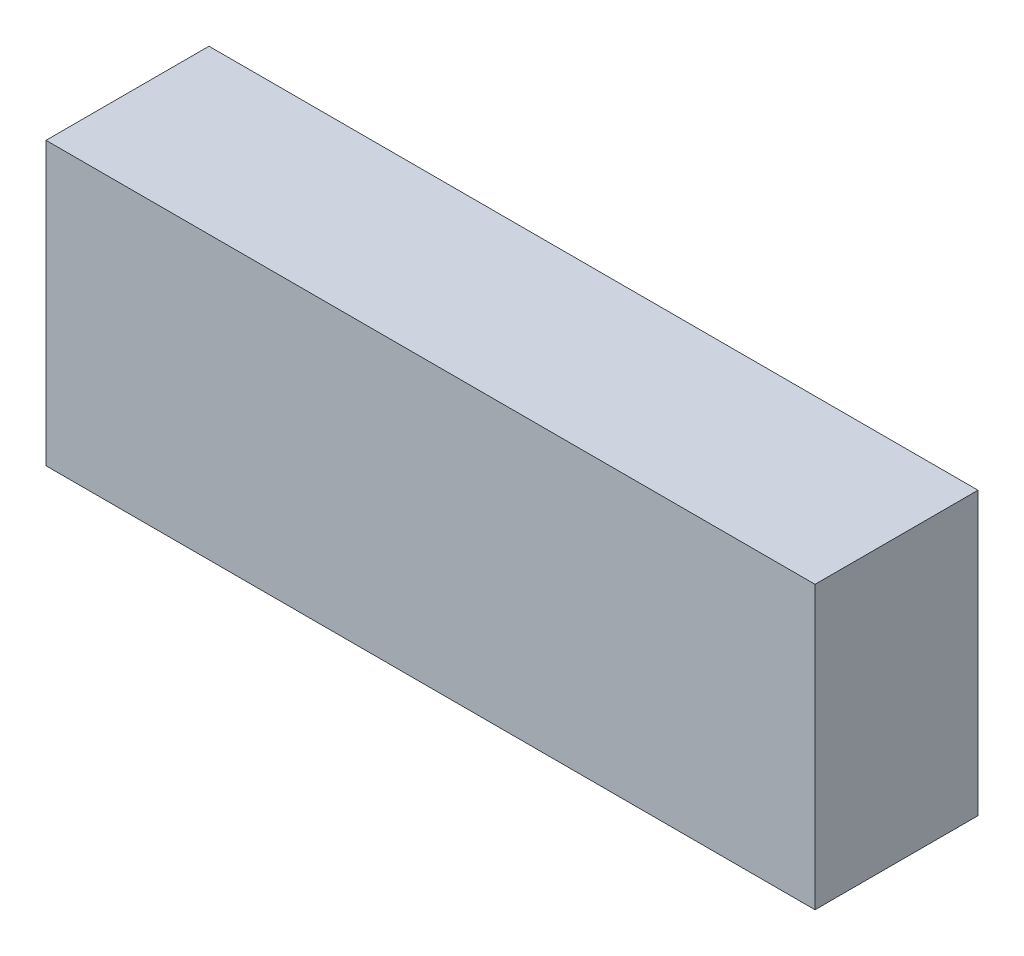
ISO-10303-21;
HEADER;
FILE_DESCRIPTION(('STEP AP214'),'2;1');
FILE_NAME('part.step','',(''),(''),'','','');
FILE_SCHEMA(('AUTOMOTIVE_DESIGN { 1 0 10303 214 1 1 1 1 }'));
ENDSEC;
DATA;
#1=APPLICATION_CONTEXT('core data for automotive mechanical design processes');
#2=APPLICATION_PROTOCOL_DEFINITION('international standard','automotive_design',2000,#1);
#3=PRODUCT_CONTEXT('',#1,'mechanical');
#4=PRODUCT('Part','Part','',(#3));
#5=PRODUCT_RELATED_PRODUCT_CATEGORY('part','',(#4));
#6=PRODUCT_DEFINITION_FORMATION('','',#4);
#7=PRODUCT_DEFINITION_CONTEXT('part definition',#1,'design');
#8=PRODUCT_DEFINITION('design','',#6,#7);
#9=PRODUCT_DEFINITION_SHAPE('','',#8);
#10=(LENGTH_UNIT() NAMED_UNIT(*) SI_UNIT(.MILLI.,.METRE.));
#11=(NAMED_UNIT(*) PLANE_ANGLE_UNIT() SI_UNIT($,.RADIAN.));
#12=(NAMED_UNIT(*) SI_UNIT($,.STERADIAN.) SOLID_ANGLE_UNIT());
#13=UNCERTAINTY_MEASURE_WITH_UNIT(LENGTH_MEASURE(1.E-05),#10,'distance_accuracy_value','');
#14=(GEOMETRIC_REPRESENTATION_CONTEXT(3) GLOBAL_UNCERTAINTY_ASSIGNED_CONTEXT((#13)) GLOBAL_UNIT_ASSIGNED_CONTEXT((#10,
#11,#12)) REPRESENTATION_CONTEXT('',''));
#15=CARTESIAN_POINT('',(0.,0.,0.));
#16=DIRECTION('',(0.,0.,1.));
#17=DIRECTION('',(1.,0.,0.));
#18=AXIS2_PLACEMENT_3D('',#15,#16,#17);
#19=CARTESIAN_POINT('',(44.8245000000004,-1.68999999999998,7.25));
#20=DIRECTION('',(1.,0.,0.));
#21=DIRECTION('',(0.,0.,-1.));
#22=AXIS2_PLACEMENT_3D('',#19,#20,#21);
#23=PLANE('',#22);
#24=DIRECTION('',(0.,-1.,0.));
#25=VECTOR('',#24,1.);
#26=CARTESIAN_POINT('',(44.8245000000004,-1.68999999999998,0.));
#27=LINE('',#26,#25);
#28=CARTESIAN_POINT('',(44.8245000000004,-1.68999999999998,0.));
#29=VERTEX_POINT('',#28);
#30=CARTESIAN_POINT('',(44.8245000000004,-14.23,0.));
#31=VERTEX_POINT('',#30);
#32=EDGE_CURVE('E128',#29,#31,#27,.T.);
#33=ORIENTED_EDGE('',*,*,#32,.T.);
#34=DIRECTION('',(0.,0.,-1.));
#35=VECTOR('',#34,1.);
#36=CARTESIAN_POINT('',(44.8245000000004,-14.23,7.25));
#37=LINE('',#36,#35);
#38=CARTESIAN_POINT('',(44.8245000000004,-14.23,7.25));
#39=VERTEX_POINT('',#38);
#40=EDGE_CURVE('E11',#39,#31,#37,.T.);
#41=ORIENTED_EDGE('',*,*,#40,.F.);
#42=DIRECTION('',(0.,-1.,0.));
#43=VECTOR('',#42,1.);
#44=CARTESIAN_POINT('',(44.8245000000004,-1.68999999999998,7.25));
#45=LINE('',#44,#43);
#46=CARTESIAN_POINT('',(44.8245000000004,-1.68999999999998,7.25));
#47=VERTEX_POINT('',#46);
#48=EDGE_CURVE('E148',#47,#39,#45,.T.);
#49=ORIENTED_EDGE('',*,*,#48,.F.);
#50=DIRECTION('',(0.,0.,-1.));
#51=VECTOR('',#50,1.);
#52=CARTESIAN_POINT('',(44.8245000000004,-1.68999999999998,7.25));
#53=LINE('',#52,#51);
#54=EDGE_CURVE('E153',#47,#29,#53,.T.);
#55=ORIENTED_EDGE('',*,*,#54,.T.);
#56=EDGE_LOOP('',(#33,#41,#49,#55));
#57=FACE_BOUND('',#56,.T.);
#58=ADVANCED_FACE('F32',(#57),#23,.F.);
#59=CARTESIAN_POINT('',(44.8245000000004,-14.23,7.25));
#60=DIRECTION('',(0.,1.,0.));
#61=DIRECTION('',(0.,0.,1.));
#62=AXIS2_PLACEMENT_3D('',#59,#60,#61);
#63=PLANE('',#62);
#64=DIRECTION('',(1.,0.,0.));
#65=VECTOR('',#64,1.);
#66=CARTESIAN_POINT('',(44.8245000000004,-14.23,0.));
#67=LINE('',#66,#65);
#68=CARTESIAN_POINT('',(79.0368014902547,-14.23,0.));
#69=VERTEX_POINT('',#68);
#70=EDGE_CURVE('E132',#31,#69,#67,.T.);
#71=ORIENTED_EDGE('',*,*,#70,.T.);
#72=DIRECTION('',(0.,0.,-1.));
#73=VECTOR('',#72,1.);
#74=CARTESIAN_POINT('',(79.0368014902547,-14.23,7.25));
#75=LINE('',#74,#73);
#76=CARTESIAN_POINT('',(79.0368014902547,-14.23,7.25));
#77=VERTEX_POINT('',#76);
#78=EDGE_CURVE('E39',#77,#69,#75,.T.);
#79=ORIENTED_EDGE('',*,*,#78,.F.);
#80=DIRECTION('',(1.,0.,0.));
#81=VECTOR('',#80,1.);
#82=CARTESIAN_POINT('',(44.8245000000004,-14.23,7.25));
#83=LINE('',#82,#81);
#84=EDGE_CURVE('E83',#39,#77,#83,.T.);
#85=ORIENTED_EDGE('',*,*,#84,.F.);
#86=ORIENTED_EDGE('',*,*,#40,.T.);
#87=EDGE_LOOP('',(#71,#79,#85,#86));
#88=FACE_BOUND('',#87,.T.);
#89=ADVANCED_FACE('F182',(#88),#63,.F.);
#90=CARTESIAN_POINT('',(79.0368014902547,-1.68999999999998,7.25));
#91=DIRECTION('',(-1.,0.,0.));
#92=DIRECTION('',(0.,0.,1.));
#93=AXIS2_PLACEMENT_3D('',#90,#91,#92);
#94=PLANE('',#93);
#95=DIRECTION('',(0.,1.,0.));
#96=VECTOR('',#95,1.);
#97=CARTESIAN_POINT('',(79.0368014902547,-1.68999999999998,0.));
#98=LINE('',#97,#96);
#99=CARTESIAN_POINT('',(79.0368014902547,-1.68999999999998,0.));
#100=VERTEX_POINT('',#99);
#101=EDGE_CURVE('E156',#69,#100,#98,.T.);
#102=ORIENTED_EDGE('',*,*,#101,.T.);
#103=DIRECTION('',(0.,0.,-1.));
#104=VECTOR('',#103,1.);
#105=CARTESIAN_POINT('',(79.0368014902547,-1.68999999999998,7.25));
#106=LINE('',#105,#104);
#107=CARTESIAN_POINT('',(79.0368014902547,-1.68999999999998,7.25));
#108=VERTEX_POINT('',#107);
#109=EDGE_CURVE('E160',#108,#100,#106,.T.);
#110=ORIENTED_EDGE('',*,*,#109,.F.);
#111=DIRECTION('',(0.,1.,0.));
#112=VECTOR('',#111,1.);
#113=CARTESIAN_POINT('',(79.0368014902547,-1.68999999999998,7.25));
#114=LINE('',#113,#112);
#115=EDGE_CURVE('E151',#77,#108,#114,.T.);
#116=ORIENTED_EDGE('',*,*,#115,.F.);
#117=ORIENTED_EDGE('',*,*,#78,.T.);
#118=EDGE_LOOP('',(#102,#110,#116,#117));
#119=FACE_BOUND('',#118,.T.);
#120=ADVANCED_FACE('F165',(#119),#94,.F.);
#121=CARTESIAN_POINT('',(44.8245000000004,-1.68999999999998,7.25));
#122=DIRECTION('',(0.,-1.,0.));
#123=DIRECTION('',(0.,0.,-1.));
#124=AXIS2_PLACEMENT_3D('',#121,#122,#123);
#125=PLANE('',#124);
#126=DIRECTION('',(-1.,0.,0.));
#127=VECTOR('',#126,1.);
#128=CARTESIAN_POINT('',(44.8245000000004,-1.68999999999998,0.));
#129=LINE('',#128,#127);
#130=EDGE_CURVE('E76',#100,#29,#129,.T.);
#131=ORIENTED_EDGE('',*,*,#130,.T.);
#132=ORIENTED_EDGE('',*,*,#54,.F.);
#133=DIRECTION('',(-1.,0.,0.));
#134=VECTOR('',#133,1.);
#135=CARTESIAN_POINT('',(44.8245000000004,-1.68999999999998,7.25));
#136=LINE('',#135,#134);
#137=EDGE_CURVE('E55',#108,#47,#136,.T.);
#138=ORIENTED_EDGE('',*,*,#137,.F.);
#139=ORIENTED_EDGE('',*,*,#109,.T.);
#140=EDGE_LOOP('',(#131,#132,#138,#139));
#141=FACE_BOUND('',#140,.T.);
#142=ADVANCED_FACE('F173',(#141),#125,.F.);
#143=CARTESIAN_POINT('',(0.,0.,7.25));
#144=DIRECTION('',(0.,0.,1.));
#145=DIRECTION('',(1.,0.,0.));
#146=AXIS2_PLACEMENT_3D('',#143,#144,#145);
#147=PLANE('',#146);
#148=ORIENTED_EDGE('',*,*,#48,.T.);
#149=ORIENTED_EDGE('',*,*,#84,.T.);
#150=ORIENTED_EDGE('',*,*,#115,.T.);
#151=ORIENTED_EDGE('',*,*,#137,.T.);
#152=EDGE_LOOP('',(#148,#149,#150,#151));
#153=FACE_BOUND('',#152,.T.);
#154=ADVANCED_FACE('F175',(#153),#147,.T.);
#155=CARTESIAN_POINT('',(0.,0.,0.));
#156=DIRECTION('',(0.,0.,1.));
#157=DIRECTION('',(1.,0.,0.));
#158=AXIS2_PLACEMENT_3D('',#155,#156,#157);
#159=PLANE('',#158);
#160=DIRECTION('',(-1.,0.,0.));
#161=VECTOR('',#160,1.);
#162=CARTESIAN_POINT('',(44.8245000000004,-2.18999999999998,0.));
#163=LINE('',#162,#161);
#164=CARTESIAN_POINT('',(78.5368014902547,-2.18999999999998,0.));
#165=VERTEX_POINT('',#164);
#166=CARTESIAN_POINT('',(45.3245000000004,-2.18999999999998,0.));
#167=VERTEX_POINT('',#166);
#168=EDGE_CURVE('E123',#165,#167,#163,.T.);
#169=ORIENTED_EDGE('',*,*,#168,.T.);
#170=DIRECTION('',(0.,-1.,0.));
#171=VECTOR('',#170,1.);
#172=CARTESIAN_POINT('',(45.3245000000004,-1.68999999999998,0.));
#173=LINE('',#172,#171);
#174=CARTESIAN_POINT('',(45.3245000000004,-13.73,0.));
#175=VERTEX_POINT('',#174);
#176=EDGE_CURVE('E142',#167,#175,#173,.T.);
#177=ORIENTED_EDGE('',*,*,#176,.T.);
#178=DIRECTION('',(1.,0.,0.));
#179=VECTOR('',#178,1.);
#180=CARTESIAN_POINT('',(44.8245000000004,-13.73,0.));
#181=LINE('',#180,#179);
#182=CARTESIAN_POINT('',(78.5368014902547,-13.73,0.));
#183=VERTEX_POINT('',#182);
#184=EDGE_CURVE('E127',#175,#183,#181,.T.);
#185=ORIENTED_EDGE('',*,*,#184,.T.);
#186=DIRECTION('',(0.,1.,0.));
#187=VECTOR('',#186,1.);
#188=CARTESIAN_POINT('',(78.5368014902547,-1.68999999999998,0.));
#189=LINE('',#188,#187);
#190=EDGE_CURVE('E46',#183,#165,#189,.T.);
#191=ORIENTED_EDGE('',*,*,#190,.T.);
#192=EDGE_LOOP('',(#169,#177,#185,#191));
#193=FACE_BOUND('',#192,.T.);
#194=ORIENTED_EDGE('',*,*,#32,.F.);
#195=ORIENTED_EDGE('',*,*,#130,.F.);
#196=ORIENTED_EDGE('',*,*,#101,.F.);
#197=ORIENTED_EDGE('',*,*,#70,.F.);
#198=EDGE_LOOP('',(#194,#195,#196,#197));
#199=FACE_BOUND('',#198,.T.);
#200=ADVANCED_FACE('F169',(#193,#199),#159,.F.);
#201=CARTESIAN_POINT('',(45.3245000000004,-1.68999999999998,7.25));
#202=DIRECTION('',(1.,0.,0.));
#203=DIRECTION('',(0.,0.,-1.));
#204=AXIS2_PLACEMENT_3D('',#201,#202,#203);
#205=PLANE('',#204);
#206=ORIENTED_EDGE('',*,*,#176,.F.);
#207=DIRECTION('',(0.,0.,-1.));
#208=VECTOR('',#207,1.);
#209=CARTESIAN_POINT('',(45.3245000000004,-2.18999999999998,7.25));
#210=LINE('',#209,#208);
#211=CARTESIAN_POINT('',(45.3245000000004,-2.18999999999998,7.05));
#212=VERTEX_POINT('',#211);
#213=EDGE_CURVE('E122',#212,#167,#210,.T.);
#214=ORIENTED_EDGE('',*,*,#213,.F.);
#215=DIRECTION('',(0.,-1.,0.));
#216=VECTOR('',#215,1.);
#217=CARTESIAN_POINT('',(45.3245000000004,-1.68999999999998,7.05));
#218=LINE('',#217,#216);
#219=CARTESIAN_POINT('',(45.3245000000004,-13.73,7.05));
#220=VERTEX_POINT('',#219);
#221=EDGE_CURVE('E110',#212,#220,#218,.T.);
#222=ORIENTED_EDGE('',*,*,#221,.T.);
#223=DIRECTION('',(0.,0.,-1.));
#224=VECTOR('',#223,1.);
#225=CARTESIAN_POINT('',(45.3245000000004,-13.73,7.25));
#226=LINE('',#225,#224);
#227=EDGE_CURVE('E120',#220,#175,#226,.T.);
#228=ORIENTED_EDGE('',*,*,#227,.T.);
#229=EDGE_LOOP('',(#206,#214,#222,#228));
#230=FACE_BOUND('',#229,.T.);
#231=ADVANCED_FACE('F119',(#230),#205,.T.);
#232=CARTESIAN_POINT('',(44.8245000000004,-13.73,7.25));
#233=DIRECTION('',(0.,1.,0.));
#234=DIRECTION('',(0.,0.,1.));
#235=AXIS2_PLACEMENT_3D('',#232,#233,#234);
#236=PLANE('',#235);
#237=ORIENTED_EDGE('',*,*,#184,.F.);
#238=ORIENTED_EDGE('',*,*,#227,.F.);
#239=DIRECTION('',(1.,0.,0.));
#240=VECTOR('',#239,1.);
#241=CARTESIAN_POINT('',(44.8245000000004,-13.73,7.05));
#242=LINE('',#241,#240);
#243=CARTESIAN_POINT('',(78.5368014902547,-13.73,7.05));
#244=VERTEX_POINT('',#243);
#245=EDGE_CURVE('E106',#220,#244,#242,.T.);
#246=ORIENTED_EDGE('',*,*,#245,.T.);
#247=DIRECTION('',(0.,0.,-1.));
#248=VECTOR('',#247,1.);
#249=CARTESIAN_POINT('',(78.5368014902547,-13.73,7.25));
#250=LINE('',#249,#248);
#251=EDGE_CURVE('E129',#244,#183,#250,.T.);
#252=ORIENTED_EDGE('',*,*,#251,.T.);
#253=EDGE_LOOP('',(#237,#238,#246,#252));
#254=FACE_BOUND('',#253,.T.);
#255=ADVANCED_FACE('F125',(#254),#236,.T.);
#256=CARTESIAN_POINT('',(78.5368014902547,-1.68999999999998,7.25));
#257=DIRECTION('',(-1.,0.,0.));
#258=DIRECTION('',(0.,0.,1.));
#259=AXIS2_PLACEMENT_3D('',#256,#257,#258);
#260=PLANE('',#259);
#261=ORIENTED_EDGE('',*,*,#190,.F.);
#262=ORIENTED_EDGE('',*,*,#251,.F.);
#263=DIRECTION('',(0.,1.,0.));
#264=VECTOR('',#263,1.);
#265=CARTESIAN_POINT('',(78.5368014902547,-1.68999999999998,7.05));
#266=LINE('',#265,#264);
#267=CARTESIAN_POINT('',(78.5368014902547,-2.18999999999998,7.05));
#268=VERTEX_POINT('',#267);
#269=EDGE_CURVE('E111',#244,#268,#266,.T.);
#270=ORIENTED_EDGE('',*,*,#269,.T.);
#271=DIRECTION('',(0.,0.,-1.));
#272=VECTOR('',#271,1.);
#273=CARTESIAN_POINT('',(78.5368014902547,-2.18999999999998,7.25));
#274=LINE('',#273,#272);
#275=EDGE_CURVE('E134',#268,#165,#274,.T.);
#276=ORIENTED_EDGE('',*,*,#275,.T.);
#277=EDGE_LOOP('',(#261,#262,#270,#276));
#278=FACE_BOUND('',#277,.T.);
#279=ADVANCED_FACE('F230',(#278),#260,.T.);
#280=CARTESIAN_POINT('',(44.8245000000004,-2.18999999999998,7.25));
#281=DIRECTION('',(0.,-1.,0.));
#282=DIRECTION('',(0.,0.,-1.));
#283=AXIS2_PLACEMENT_3D('',#280,#281,#282);
#284=PLANE('',#283);
#285=ORIENTED_EDGE('',*,*,#168,.F.);
#286=ORIENTED_EDGE('',*,*,#275,.F.);
#287=DIRECTION('',(-1.,0.,0.));
#288=VECTOR('',#287,1.);
#289=CARTESIAN_POINT('',(44.8245000000004,-2.18999999999998,7.05));
#290=LINE('',#289,#288);
#291=EDGE_CURVE('E137',#268,#212,#290,.T.);
#292=ORIENTED_EDGE('',*,*,#291,.T.);
#293=ORIENTED_EDGE('',*,*,#213,.T.);
#294=EDGE_LOOP('',(#285,#286,#292,#293));
#295=FACE_BOUND('',#294,.T.);
#296=ADVANCED_FACE('F239',(#295),#284,.T.);
#297=CARTESIAN_POINT('',(0.,0.,7.05));
#298=DIRECTION('',(0.,0.,1.));
#299=DIRECTION('',(1.,0.,0.));
#300=AXIS2_PLACEMENT_3D('',#297,#298,#299);
#301=PLANE('',#300);
#302=ORIENTED_EDGE('',*,*,#221,.F.);
#303=ORIENTED_EDGE('',*,*,#291,.F.);
#304=ORIENTED_EDGE('',*,*,#269,.F.);
#305=ORIENTED_EDGE('',*,*,#245,.F.);
#306=EDGE_LOOP('',(#302,#303,#304,#305));
#307=FACE_BOUND('',#306,.T.);
#308=ADVANCED_FACE('F108',(#307),#301,.F.);
#309=CLOSED_SHELL('',(#58,#89,#120,#142,#154,#200,#231,#255,#279,#296,#308));
#310=MANIFOLD_SOLID_BREP('B2',#309);
#311=ADVANCED_BREP_SHAPE_REPRESENTATION('',(#18,#310),#14);
#312=SHAPE_DEFINITION_REPRESENTATION(#9,#311);
ENDSEC;
END-ISO-10303-21;
